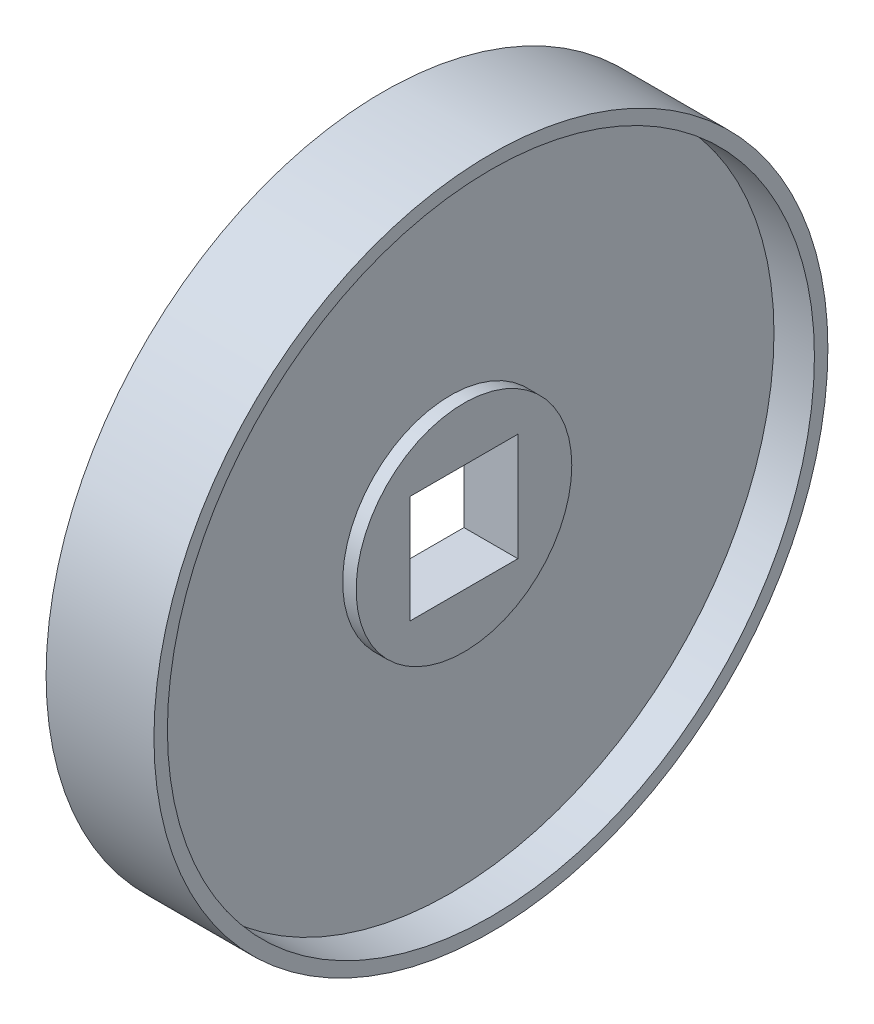
ISO-10303-21;
HEADER;
FILE_DESCRIPTION(('STEP AP214'),'2;1');
FILE_NAME('part.step','',(''),(''),'','','');
FILE_SCHEMA(('AUTOMOTIVE_DESIGN { 1 0 10303 214 1 1 1 1 }'));
ENDSEC;
DATA;
#1=APPLICATION_CONTEXT('core data for automotive mechanical design processes');
#2=APPLICATION_PROTOCOL_DEFINITION('international standard','automotive_design',2000,#1);
#3=PRODUCT_CONTEXT('',#1,'mechanical');
#4=PRODUCT('Part','Part','',(#3));
#5=PRODUCT_RELATED_PRODUCT_CATEGORY('part','',(#4));
#6=PRODUCT_DEFINITION_FORMATION('','',#4);
#7=PRODUCT_DEFINITION_CONTEXT('part definition',#1,'design');
#8=PRODUCT_DEFINITION('design','',#6,#7);
#9=PRODUCT_DEFINITION_SHAPE('','',#8);
#10=(LENGTH_UNIT() NAMED_UNIT(*) SI_UNIT(.MILLI.,.METRE.));
#11=(NAMED_UNIT(*) PLANE_ANGLE_UNIT() SI_UNIT($,.RADIAN.));
#12=(NAMED_UNIT(*) SI_UNIT($,.STERADIAN.) SOLID_ANGLE_UNIT());
#13=UNCERTAINTY_MEASURE_WITH_UNIT(LENGTH_MEASURE(1.E-05),#10,'distance_accuracy_value','');
#14=(GEOMETRIC_REPRESENTATION_CONTEXT(3) GLOBAL_UNCERTAINTY_ASSIGNED_CONTEXT((#13)) GLOBAL_UNIT_ASSIGNED_CONTEXT((#10,
#11,#12)) REPRESENTATION_CONTEXT('',''));
#15=CARTESIAN_POINT('',(0.,0.,0.));
#16=DIRECTION('',(0.,0.,1.));
#17=DIRECTION('',(1.,0.,0.));
#18=AXIS2_PLACEMENT_3D('',#15,#16,#17);
#19=CARTESIAN_POINT('',(-6.35,0.,0.));
#20=DIRECTION('',(1.,0.,0.));
#21=DIRECTION('',(0.,0.,-1.));
#22=AXIS2_PLACEMENT_3D('',#19,#20,#21);
#23=PLANE('',#22);
#24=DIRECTION('',(0.,0.,-1.));
#25=VECTOR('',#24,1.);
#26=CARTESIAN_POINT('',(-6.35,-12.7,0.));
#27=LINE('',#26,#25);
#28=CARTESIAN_POINT('',(-6.35,-12.7,12.7));
#29=VERTEX_POINT('',#28);
#30=CARTESIAN_POINT('',(-6.35,-12.7,-12.7));
#31=VERTEX_POINT('',#30);
#32=EDGE_CURVE('E126',#29,#31,#27,.T.);
#33=ORIENTED_EDGE('',*,*,#32,.T.);
#34=DIRECTION('',(0.,1.,0.));
#35=VECTOR('',#34,1.);
#36=CARTESIAN_POINT('',(-6.35,0.,-12.7));
#37=LINE('',#36,#35);
#38=CARTESIAN_POINT('',(-6.35,12.7,-12.7));
#39=VERTEX_POINT('',#38);
#40=EDGE_CURVE('E107',#31,#39,#37,.T.);
#41=ORIENTED_EDGE('',*,*,#40,.T.);
#42=DIRECTION('',(0.,0.,1.));
#43=VECTOR('',#42,1.);
#44=CARTESIAN_POINT('',(-6.35,12.7,0.));
#45=LINE('',#44,#43);
#46=CARTESIAN_POINT('',(-6.35,12.7,12.7));
#47=VERTEX_POINT('',#46);
#48=EDGE_CURVE('E130',#39,#47,#45,.T.);
#49=ORIENTED_EDGE('',*,*,#48,.T.);
#50=DIRECTION('',(0.,-1.,0.));
#51=VECTOR('',#50,1.);
#52=CARTESIAN_POINT('',(-6.35,0.,12.7));
#53=LINE('',#52,#51);
#54=EDGE_CURVE('E85',#47,#29,#53,.T.);
#55=ORIENTED_EDGE('',*,*,#54,.T.);
#56=EDGE_LOOP('',(#33,#41,#49,#55));
#57=FACE_BOUND('',#56,.T.);
#58=CARTESIAN_POINT('',(-6.35,0.,0.));
#59=DIRECTION('',(1.,0.,0.));
#60=DIRECTION('',(0.,0.,-1.));
#61=AXIS2_PLACEMENT_3D('',#58,#59,#60);
#62=CIRCLE('',#61,25.4);
#63=CARTESIAN_POINT('',(-6.35000000000001,0.,-25.4));
#64=VERTEX_POINT('',#63);
#65=EDGE_CURVE('E110',#64,#64,#62,.T.);
#66=ORIENTED_EDGE('',*,*,#65,.F.);
#67=EDGE_LOOP('',(#66));
#68=FACE_BOUND('',#67,.T.);
#69=ADVANCED_FACE('F35',(#57,#68),#23,.F.);
#70=CARTESIAN_POINT('',(6.35,0.,0.));
#71=DIRECTION('',(1.,0.,0.));
#72=DIRECTION('',(0.,0.,-1.));
#73=AXIS2_PLACEMENT_3D('',#70,#71,#72);
#74=CYLINDRICAL_SURFACE('',#73,25.4);
#75=ORIENTED_EDGE('',*,*,#65,.T.);
#76=EDGE_LOOP('',(#75));
#77=FACE_BOUND('',#76,.T.);
#78=CARTESIAN_POINT('',(-3.17499999999999,0.,0.));
#79=DIRECTION('',(1.,0.,0.));
#80=DIRECTION('',(0.,0.,-1.));
#81=AXIS2_PLACEMENT_3D('',#78,#79,#80);
#82=CIRCLE('',#81,25.4);
#83=CARTESIAN_POINT('',(-3.175,0.,-25.4));
#84=VERTEX_POINT('',#83);
#85=EDGE_CURVE('E78',#84,#84,#82,.T.);
#86=ORIENTED_EDGE('',*,*,#85,.F.);
#87=EDGE_LOOP('',(#86));
#88=FACE_BOUND('',#87,.T.);
#89=ADVANCED_FACE('F144',(#77,#88),#74,.T.);
#90=CARTESIAN_POINT('',(3.175,0.,0.));
#91=DIRECTION('',(1.,0.,0.));
#92=DIRECTION('',(0.,0.,-1.));
#93=AXIS2_PLACEMENT_3D('',#90,#91,#92);
#94=CIRCLE('',#93,25.4);
#95=CARTESIAN_POINT('',(3.175,0.,-25.4));
#96=VERTEX_POINT('',#95);
#97=EDGE_CURVE('E116',#96,#96,#94,.T.);
#98=ORIENTED_EDGE('',*,*,#97,.T.);
#99=EDGE_LOOP('',(#98));
#100=FACE_BOUND('',#99,.T.);
#101=CARTESIAN_POINT('',(6.35,0.,0.));
#102=DIRECTION('',(1.,0.,0.));
#103=DIRECTION('',(0.,0.,-1.));
#104=AXIS2_PLACEMENT_3D('',#101,#102,#103);
#105=CIRCLE('',#104,25.4);
#106=CARTESIAN_POINT('',(6.35,0.,-25.4));
#107=VERTEX_POINT('',#106);
#108=EDGE_CURVE('E113',#107,#107,#105,.T.);
#109=ORIENTED_EDGE('',*,*,#108,.F.);
#110=EDGE_LOOP('',(#109));
#111=FACE_BOUND('',#110,.T.);
#112=ADVANCED_FACE('F150',(#100,#111),#74,.T.);
#113=CARTESIAN_POINT('',(6.35,0.,0.));
#114=DIRECTION('',(1.,0.,0.));
#115=DIRECTION('',(0.,0.,-1.));
#116=AXIS2_PLACEMENT_3D('',#113,#114,#115);
#117=PLANE('',#116);
#118=DIRECTION('',(0.,1.,0.));
#119=VECTOR('',#118,1.);
#120=CARTESIAN_POINT('',(6.35,0.,-12.7));
#121=LINE('',#120,#119);
#122=CARTESIAN_POINT('',(6.35,-12.7,-12.7));
#123=VERTEX_POINT('',#122);
#124=CARTESIAN_POINT('',(6.35,12.7,-12.7));
#125=VERTEX_POINT('',#124);
#126=EDGE_CURVE('E11',#123,#125,#121,.T.);
#127=ORIENTED_EDGE('',*,*,#126,.F.);
#128=DIRECTION('',(0.,0.,-1.));
#129=VECTOR('',#128,1.);
#130=CARTESIAN_POINT('',(6.35,-12.7,0.));
#131=LINE('',#130,#129);
#132=CARTESIAN_POINT('',(6.35,-12.7,12.7));
#133=VERTEX_POINT('',#132);
#134=EDGE_CURVE('E43',#133,#123,#131,.T.);
#135=ORIENTED_EDGE('',*,*,#134,.F.);
#136=DIRECTION('',(0.,-1.,0.));
#137=VECTOR('',#136,1.);
#138=CARTESIAN_POINT('',(6.35,0.,12.7));
#139=LINE('',#138,#137);
#140=CARTESIAN_POINT('',(6.35,12.7,12.7));
#141=VERTEX_POINT('',#140);
#142=EDGE_CURVE('E77',#141,#133,#139,.T.);
#143=ORIENTED_EDGE('',*,*,#142,.F.);
#144=DIRECTION('',(0.,0.,1.));
#145=VECTOR('',#144,1.);
#146=CARTESIAN_POINT('',(6.35,12.7,0.));
#147=LINE('',#146,#145);
#148=EDGE_CURVE('E72',#125,#141,#147,.T.);
#149=ORIENTED_EDGE('',*,*,#148,.F.);
#150=EDGE_LOOP('',(#127,#135,#143,#149));
#151=FACE_BOUND('',#150,.T.);
#152=ORIENTED_EDGE('',*,*,#108,.T.);
#153=EDGE_LOOP('',(#152));
#154=FACE_BOUND('',#153,.T.);
#155=ADVANCED_FACE('F90',(#151,#154),#117,.T.);
#156=CARTESIAN_POINT('',(-3.17499999999999,0.,0.));
#157=DIRECTION('',(1.,0.,0.));
#158=DIRECTION('',(0.,0.,-1.));
#159=AXIS2_PLACEMENT_3D('',#156,#157,#158);
#160=PLANE('',#159);
#161=CARTESIAN_POINT('',(-3.17499999999999,0.,0.));
#162=DIRECTION('',(1.,0.,0.));
#163=DIRECTION('',(0.,0.,-1.));
#164=AXIS2_PLACEMENT_3D('',#161,#162,#163);
#165=CIRCLE('',#164,76.2);
#166=CARTESIAN_POINT('',(-3.175,0.,-76.2));
#167=VERTEX_POINT('',#166);
#168=EDGE_CURVE('E97',#167,#167,#165,.T.);
#169=ORIENTED_EDGE('',*,*,#168,.F.);
#170=EDGE_LOOP('',(#169));
#171=FACE_BOUND('',#170,.T.);
#172=ORIENTED_EDGE('',*,*,#85,.T.);
#173=EDGE_LOOP('',(#172));
#174=FACE_BOUND('',#173,.T.);
#175=ADVANCED_FACE('F154',(#171,#174),#160,.F.);
#176=CARTESIAN_POINT('',(3.175,0.,0.));
#177=DIRECTION('',(1.,0.,0.));
#178=DIRECTION('',(0.,0.,-1.));
#179=AXIS2_PLACEMENT_3D('',#176,#177,#178);
#180=PLANE('',#179);
#181=CARTESIAN_POINT('',(3.17500000000001,0.,0.));
#182=DIRECTION('',(1.,0.,0.));
#183=DIRECTION('',(0.,0.,-1.));
#184=AXIS2_PLACEMENT_3D('',#181,#182,#183);
#185=CIRCLE('',#184,76.2);
#186=CARTESIAN_POINT('',(3.175,0.,-76.2));
#187=VERTEX_POINT('',#186);
#188=EDGE_CURVE('E119',#187,#187,#185,.T.);
#189=ORIENTED_EDGE('',*,*,#188,.T.);
#190=EDGE_LOOP('',(#189));
#191=FACE_BOUND('',#190,.T.);
#192=ORIENTED_EDGE('',*,*,#97,.F.);
#193=EDGE_LOOP('',(#192));
#194=FACE_BOUND('',#193,.T.);
#195=ADVANCED_FACE('F156',(#191,#194),#180,.T.);
#196=CARTESIAN_POINT('',(6.35,0.,0.));
#197=DIRECTION('',(1.,0.,0.));
#198=DIRECTION('',(0.,0.,-1.));
#199=AXIS2_PLACEMENT_3D('',#196,#197,#198);
#200=CYLINDRICAL_SURFACE('',#199,79.375);
#201=CARTESIAN_POINT('',(12.7,0.,0.));
#202=DIRECTION('',(1.,0.,0.));
#203=DIRECTION('',(0.,0.,-1.));
#204=AXIS2_PLACEMENT_3D('',#201,#202,#203);
#205=CIRCLE('',#204,79.375);
#206=CARTESIAN_POINT('',(12.7,0.,-79.3750000000001));
#207=VERTEX_POINT('',#206);
#208=EDGE_CURVE('E101',#207,#207,#205,.T.);
#209=ORIENTED_EDGE('',*,*,#208,.F.);
#210=EDGE_LOOP('',(#209));
#211=FACE_BOUND('',#210,.T.);
#212=CARTESIAN_POINT('',(-12.7,0.,0.));
#213=DIRECTION('',(1.,0.,0.));
#214=DIRECTION('',(0.,0.,-1.));
#215=AXIS2_PLACEMENT_3D('',#212,#213,#214);
#216=CIRCLE('',#215,79.375);
#217=CARTESIAN_POINT('',(-12.7,0.,-79.3750000000001));
#218=VERTEX_POINT('',#217);
#219=EDGE_CURVE('E104',#218,#218,#216,.T.);
#220=ORIENTED_EDGE('',*,*,#219,.T.);
#221=EDGE_LOOP('',(#220));
#222=FACE_BOUND('',#221,.T.);
#223=ADVANCED_FACE('F159',(#211,#222),#200,.T.);
#224=CARTESIAN_POINT('',(-12.7,0.,-79.3750000000001));
#225=DIRECTION('',(-1.,0.,0.));
#226=DIRECTION('',(0.,0.,1.));
#227=AXIS2_PLACEMENT_3D('',#224,#225,#226);
#228=PLANE('',#227);
#229=CARTESIAN_POINT('',(-12.7,0.,0.));
#230=DIRECTION('',(1.,0.,0.));
#231=DIRECTION('',(0.,0.,-1.));
#232=AXIS2_PLACEMENT_3D('',#229,#230,#231);
#233=CIRCLE('',#232,76.2);
#234=CARTESIAN_POINT('',(-12.7,0.,-76.2000000000001));
#235=VERTEX_POINT('',#234);
#236=EDGE_CURVE('E94',#235,#235,#233,.T.);
#237=ORIENTED_EDGE('',*,*,#236,.T.);
#238=EDGE_LOOP('',(#237));
#239=FACE_BOUND('',#238,.T.);
#240=ORIENTED_EDGE('',*,*,#219,.F.);
#241=EDGE_LOOP('',(#240));
#242=FACE_BOUND('',#241,.T.);
#243=ADVANCED_FACE('F37',(#239,#242),#228,.T.);
#244=CARTESIAN_POINT('',(6.35,0.,0.));
#245=DIRECTION('',(1.,0.,0.));
#246=DIRECTION('',(0.,0.,-1.));
#247=AXIS2_PLACEMENT_3D('',#244,#245,#246);
#248=CYLINDRICAL_SURFACE('',#247,76.2);
#249=ORIENTED_EDGE('',*,*,#168,.T.);
#250=EDGE_LOOP('',(#249));
#251=FACE_BOUND('',#250,.T.);
#252=ORIENTED_EDGE('',*,*,#236,.F.);
#253=EDGE_LOOP('',(#252));
#254=FACE_BOUND('',#253,.T.);
#255=ADVANCED_FACE('F175',(#251,#254),#248,.F.);
#256=CARTESIAN_POINT('',(12.7,0.,-79.3750000000001));
#257=DIRECTION('',(-1.,0.,0.));
#258=DIRECTION('',(0.,0.,1.));
#259=AXIS2_PLACEMENT_3D('',#256,#257,#258);
#260=PLANE('',#259);
#261=CARTESIAN_POINT('',(12.7,0.,0.));
#262=DIRECTION('',(1.,0.,0.));
#263=DIRECTION('',(0.,0.,-1.));
#264=AXIS2_PLACEMENT_3D('',#261,#262,#263);
#265=CIRCLE('',#264,76.2);
#266=CARTESIAN_POINT('',(12.7,0.,-76.2000000000001));
#267=VERTEX_POINT('',#266);
#268=EDGE_CURVE('E98',#267,#267,#265,.T.);
#269=ORIENTED_EDGE('',*,*,#268,.F.);
#270=EDGE_LOOP('',(#269));
#271=FACE_BOUND('',#270,.T.);
#272=ORIENTED_EDGE('',*,*,#208,.T.);
#273=EDGE_LOOP('',(#272));
#274=FACE_BOUND('',#273,.T.);
#275=ADVANCED_FACE('F171',(#271,#274),#260,.F.);
#276=ORIENTED_EDGE('',*,*,#268,.T.);
#277=EDGE_LOOP('',(#276));
#278=FACE_BOUND('',#277,.T.);
#279=ORIENTED_EDGE('',*,*,#188,.F.);
#280=EDGE_LOOP('',(#279));
#281=FACE_BOUND('',#280,.T.);
#282=ADVANCED_FACE('F172',(#278,#281),#248,.F.);
#283=CARTESIAN_POINT('',(-12.7,-12.7,-12.7));
#284=DIRECTION('',(0.,0.,-1.));
#285=DIRECTION('',(-1.,0.,0.));
#286=AXIS2_PLACEMENT_3D('',#283,#284,#285);
#287=PLANE('',#286);
#288=DIRECTION('',(1.,0.,0.));
#289=VECTOR('',#288,1.);
#290=CARTESIAN_POINT('',(-12.7,-12.7,-12.7));
#291=LINE('',#290,#289);
#292=EDGE_CURVE('E132',#31,#123,#291,.T.);
#293=ORIENTED_EDGE('',*,*,#292,.T.);
#294=ORIENTED_EDGE('',*,*,#126,.T.);
#295=DIRECTION('',(1.,0.,0.));
#296=VECTOR('',#295,1.);
#297=CARTESIAN_POINT('',(-12.7,12.7,-12.7));
#298=LINE('',#297,#296);
#299=EDGE_CURVE('E55',#39,#125,#298,.T.);
#300=ORIENTED_EDGE('',*,*,#299,.F.);
#301=ORIENTED_EDGE('',*,*,#40,.F.);
#302=EDGE_LOOP('',(#293,#294,#300,#301));
#303=FACE_BOUND('',#302,.T.);
#304=ADVANCED_FACE('F138',(#303),#287,.F.);
#305=CARTESIAN_POINT('',(-12.7,-12.7,12.7));
#306=DIRECTION('',(0.,-1.,0.));
#307=DIRECTION('',(0.,0.,-1.));
#308=AXIS2_PLACEMENT_3D('',#305,#306,#307);
#309=PLANE('',#308);
#310=DIRECTION('',(1.,0.,0.));
#311=VECTOR('',#310,1.);
#312=CARTESIAN_POINT('',(-12.7,-12.7,12.7));
#313=LINE('',#312,#311);
#314=EDGE_CURVE('E87',#29,#133,#313,.T.);
#315=ORIENTED_EDGE('',*,*,#314,.T.);
#316=ORIENTED_EDGE('',*,*,#134,.T.);
#317=ORIENTED_EDGE('',*,*,#292,.F.);
#318=ORIENTED_EDGE('',*,*,#32,.F.);
#319=EDGE_LOOP('',(#315,#316,#317,#318));
#320=FACE_BOUND('',#319,.T.);
#321=ADVANCED_FACE('F140',(#320),#309,.F.);
#322=CARTESIAN_POINT('',(-12.7,-12.7,12.7));
#323=DIRECTION('',(0.,0.,1.));
#324=DIRECTION('',(1.,0.,0.));
#325=AXIS2_PLACEMENT_3D('',#322,#323,#324);
#326=PLANE('',#325);
#327=DIRECTION('',(1.,0.,0.));
#328=VECTOR('',#327,1.);
#329=CARTESIAN_POINT('',(-12.7,12.7,12.7));
#330=LINE('',#329,#328);
#331=EDGE_CURVE('E50',#47,#141,#330,.T.);
#332=ORIENTED_EDGE('',*,*,#331,.T.);
#333=ORIENTED_EDGE('',*,*,#142,.T.);
#334=ORIENTED_EDGE('',*,*,#314,.F.);
#335=ORIENTED_EDGE('',*,*,#54,.F.);
#336=EDGE_LOOP('',(#332,#333,#334,#335));
#337=FACE_BOUND('',#336,.T.);
#338=ADVANCED_FACE('F81',(#337),#326,.F.);
#339=CARTESIAN_POINT('',(-12.7,12.7,12.7));
#340=DIRECTION('',(0.,1.,0.));
#341=DIRECTION('',(0.,0.,1.));
#342=AXIS2_PLACEMENT_3D('',#339,#340,#341);
#343=PLANE('',#342);
#344=ORIENTED_EDGE('',*,*,#299,.T.);
#345=ORIENTED_EDGE('',*,*,#148,.T.);
#346=ORIENTED_EDGE('',*,*,#331,.F.);
#347=ORIENTED_EDGE('',*,*,#48,.F.);
#348=EDGE_LOOP('',(#344,#345,#346,#347));
#349=FACE_BOUND('',#348,.T.);
#350=ADVANCED_FACE('F73',(#349),#343,.F.);
#351=CLOSED_SHELL('',(#69,#89,#112,#155,#175,#195,#223,#243,#255,#275,#282,#304,#321,#338,#350));
#352=MANIFOLD_SOLID_BREP('B2',#351);
#353=ADVANCED_BREP_SHAPE_REPRESENTATION('',(#18,#352),#14);
#354=SHAPE_DEFINITION_REPRESENTATION(#9,#353);
ENDSEC;
END-ISO-10303-21;
